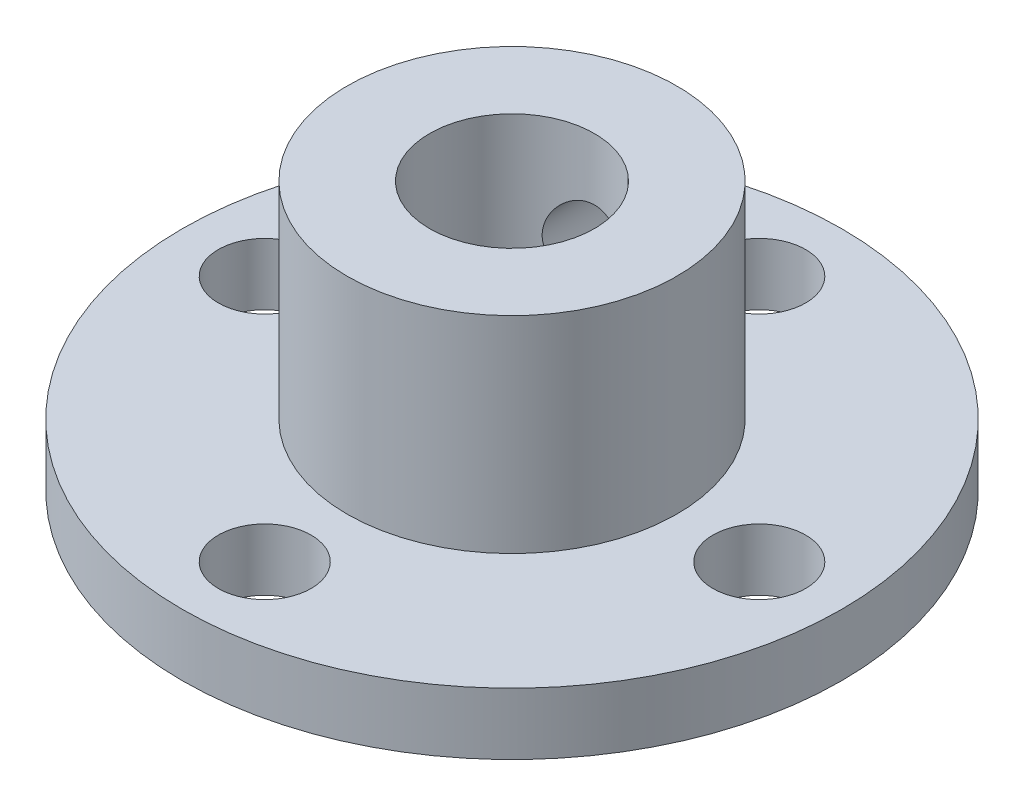
ISO-10303-21;
HEADER;
FILE_DESCRIPTION(('STEP AP214'),'2;1');
FILE_NAME('part.step','',(''),(''),'','','');
FILE_SCHEMA(('AUTOMOTIVE_DESIGN { 1 0 10303 214 1 1 1 1 }'));
ENDSEC;
DATA;
#1=APPLICATION_CONTEXT('core data for automotive mechanical design processes');
#2=APPLICATION_PROTOCOL_DEFINITION('international standard','automotive_design',2000,#1);
#3=PRODUCT_CONTEXT('',#1,'mechanical');
#4=PRODUCT('Part','Part','',(#3));
#5=PRODUCT_RELATED_PRODUCT_CATEGORY('part','',(#4));
#6=PRODUCT_DEFINITION_FORMATION('','',#4);
#7=PRODUCT_DEFINITION_CONTEXT('part definition',#1,'design');
#8=PRODUCT_DEFINITION('design','',#6,#7);
#9=PRODUCT_DEFINITION_SHAPE('','',#8);
#10=(LENGTH_UNIT() NAMED_UNIT(*) SI_UNIT(.MILLI.,.METRE.));
#11=(NAMED_UNIT(*) PLANE_ANGLE_UNIT() SI_UNIT($,.RADIAN.));
#12=(NAMED_UNIT(*) SI_UNIT($,.STERADIAN.) SOLID_ANGLE_UNIT());
#13=UNCERTAINTY_MEASURE_WITH_UNIT(LENGTH_MEASURE(1.E-05),#10,'distance_accuracy_value','');
#14=(GEOMETRIC_REPRESENTATION_CONTEXT(3) GLOBAL_UNCERTAINTY_ASSIGNED_CONTEXT((#13)) GLOBAL_UNIT_ASSIGNED_CONTEXT((#10,
#11,#12)) REPRESENTATION_CONTEXT('',''));
#15=CARTESIAN_POINT('',(0.,0.,0.));
#16=DIRECTION('',(0.,0.,1.));
#17=DIRECTION('',(1.,0.,0.));
#18=AXIS2_PLACEMENT_3D('',#15,#16,#17);
#19=CARTESIAN_POINT('',(0.,3.,0.));
#20=DIRECTION('',(0.,-1.,0.));
#21=DIRECTION('',(0.,0.,-1.));
#22=AXIS2_PLACEMENT_3D('',#19,#20,#21);
#23=CYLINDRICAL_SURFACE('',#22,16.);
#24=CARTESIAN_POINT('',(0.,3.,0.));
#25=DIRECTION('',(0.,1.,0.));
#26=DIRECTION('',(0.,0.,1.));
#27=AXIS2_PLACEMENT_3D('',#24,#25,#26);
#28=CIRCLE('',#27,16.);
#29=CARTESIAN_POINT('',(0.,3.,16.));
#30=VERTEX_POINT('',#29);
#31=EDGE_CURVE('E48',#30,#30,#28,.T.);
#32=ORIENTED_EDGE('',*,*,#31,.F.);
#33=EDGE_LOOP('',(#32));
#34=FACE_BOUND('',#33,.T.);
#35=CARTESIAN_POINT('',(0.,0.,0.));
#36=DIRECTION('',(0.,1.,0.));
#37=DIRECTION('',(0.,0.,1.));
#38=AXIS2_PLACEMENT_3D('',#35,#36,#37);
#39=CIRCLE('',#38,16.);
#40=CARTESIAN_POINT('',(0.,0.,16.));
#41=VERTEX_POINT('',#40);
#42=EDGE_CURVE('E43',#41,#41,#39,.T.);
#43=ORIENTED_EDGE('',*,*,#42,.T.);
#44=EDGE_LOOP('',(#43));
#45=FACE_BOUND('',#44,.T.);
#46=ADVANCED_FACE('F40',(#34,#45),#23,.T.);
#47=CARTESIAN_POINT('',(0.,3.,0.));
#48=DIRECTION('',(0.,1.,0.));
#49=DIRECTION('',(0.,0.,1.));
#50=AXIS2_PLACEMENT_3D('',#47,#48,#49);
#51=PLANE('',#50);
#52=CARTESIAN_POINT('',(0.,3.,-12.));
#53=DIRECTION('',(0.,1.,0.));
#54=DIRECTION('',(0.,0.,1.));
#55=AXIS2_PLACEMENT_3D('',#52,#53,#54);
#56=CIRCLE('',#55,2.25);
#57=CARTESIAN_POINT('',(0.,3.,-9.75));
#58=VERTEX_POINT('',#57);
#59=EDGE_CURVE('E90',#58,#58,#56,.T.);
#60=ORIENTED_EDGE('',*,*,#59,.F.);
#61=EDGE_LOOP('',(#60));
#62=FACE_BOUND('',#61,.T.);
#63=CARTESIAN_POINT('',(12.0000000000003,3.,-3.38856148926383E-13));
#64=DIRECTION('',(0.,1.,0.));
#65=DIRECTION('',(0.,0.,1.));
#66=AXIS2_PLACEMENT_3D('',#63,#64,#65);
#67=CIRCLE('',#66,2.25000000000027);
#68=CARTESIAN_POINT('',(12.0000000000003,3.,2.24999999999993));
#69=VERTEX_POINT('',#68);
#70=EDGE_CURVE('E86',#69,#69,#67,.T.);
#71=ORIENTED_EDGE('',*,*,#70,.F.);
#72=EDGE_LOOP('',(#71));
#73=FACE_BOUND('',#72,.T.);
#74=CARTESIAN_POINT('',(6.77712297852766E-13,3.,12.));
#75=DIRECTION('',(0.,1.,0.));
#76=DIRECTION('',(0.,0.,1.));
#77=AXIS2_PLACEMENT_3D('',#74,#75,#76);
#78=CIRCLE('',#77,2.25000000000073);
#79=CARTESIAN_POINT('',(6.77712297852766E-13,3.,14.2500000000007));
#80=VERTEX_POINT('',#79);
#81=EDGE_CURVE('E78',#80,#80,#78,.T.);
#82=ORIENTED_EDGE('',*,*,#81,.F.);
#83=EDGE_LOOP('',(#82));
#84=FACE_BOUND('',#83,.T.);
#85=CARTESIAN_POINT('',(-11.9999999999997,3.,3.4032572508536E-13));
#86=DIRECTION('',(0.,1.,0.));
#87=DIRECTION('',(0.,0.,1.));
#88=AXIS2_PLACEMENT_3D('',#85,#86,#87);
#89=CIRCLE('',#88,2.25000000000054);
#90=CARTESIAN_POINT('',(-11.9999999999997,3.,2.25000000000088));
#91=VERTEX_POINT('',#90);
#92=EDGE_CURVE('E68',#91,#91,#89,.T.);
#93=ORIENTED_EDGE('',*,*,#92,.F.);
#94=EDGE_LOOP('',(#93));
#95=FACE_BOUND('',#94,.T.);
#96=CARTESIAN_POINT('',(0.,3.,0.));
#97=DIRECTION('',(0.,1.,0.));
#98=DIRECTION('',(0.,0.,1.));
#99=AXIS2_PLACEMENT_3D('',#96,#97,#98);
#100=CIRCLE('',#99,8.);
#101=CARTESIAN_POINT('',(0.,3.,8.));
#102=VERTEX_POINT('',#101);
#103=EDGE_CURVE('E10',#102,#102,#100,.T.);
#104=ORIENTED_EDGE('',*,*,#103,.F.);
#105=EDGE_LOOP('',(#104));
#106=FACE_BOUND('',#105,.T.);
#107=ORIENTED_EDGE('',*,*,#31,.T.);
#108=EDGE_LOOP('',(#107));
#109=FACE_BOUND('',#108,.T.);
#110=ADVANCED_FACE('F150',(#62,#73,#84,#95,#106,#109),#51,.T.);
#111=CARTESIAN_POINT('',(0.,0.,0.));
#112=DIRECTION('',(0.,1.,0.));
#113=DIRECTION('',(0.,0.,1.));
#114=AXIS2_PLACEMENT_3D('',#111,#112,#113);
#115=PLANE('',#114);
#116=CARTESIAN_POINT('',(0.,0.,-12.));
#117=DIRECTION('',(0.,1.,0.));
#118=DIRECTION('',(0.,0.,1.));
#119=AXIS2_PLACEMENT_3D('',#116,#117,#118);
#120=CIRCLE('',#119,2.25);
#121=CARTESIAN_POINT('',(0.,0.,-9.75));
#122=VERTEX_POINT('',#121);
#123=EDGE_CURVE('E67',#122,#122,#120,.F.);
#124=ORIENTED_EDGE('',*,*,#123,.F.);
#125=EDGE_LOOP('',(#124));
#126=FACE_BOUND('',#125,.T.);
#127=CARTESIAN_POINT('',(12.0000000000003,0.,-3.38856148926383E-13));
#128=DIRECTION('',(0.,1.,0.));
#129=DIRECTION('',(0.,0.,1.));
#130=AXIS2_PLACEMENT_3D('',#127,#128,#129);
#131=CIRCLE('',#130,2.25000000000027);
#132=CARTESIAN_POINT('',(12.0000000000003,0.,2.24999999999993));
#133=VERTEX_POINT('',#132);
#134=EDGE_CURVE('E82',#133,#133,#131,.F.);
#135=ORIENTED_EDGE('',*,*,#134,.F.);
#136=EDGE_LOOP('',(#135));
#137=FACE_BOUND('',#136,.T.);
#138=CARTESIAN_POINT('',(6.77712297852766E-13,0.,12.));
#139=DIRECTION('',(0.,1.,0.));
#140=DIRECTION('',(0.,0.,1.));
#141=AXIS2_PLACEMENT_3D('',#138,#139,#140);
#142=CIRCLE('',#141,2.25000000000073);
#143=CARTESIAN_POINT('',(6.77712297852766E-13,0.,14.2500000000007));
#144=VERTEX_POINT('',#143);
#145=EDGE_CURVE('E72',#144,#144,#142,.F.);
#146=ORIENTED_EDGE('',*,*,#145,.F.);
#147=EDGE_LOOP('',(#146));
#148=FACE_BOUND('',#147,.T.);
#149=CARTESIAN_POINT('',(-11.9999999999997,0.,3.4032572508536E-13));
#150=DIRECTION('',(0.,1.,0.));
#151=DIRECTION('',(0.,0.,1.));
#152=AXIS2_PLACEMENT_3D('',#149,#150,#151);
#153=CIRCLE('',#152,2.25000000000054);
#154=CARTESIAN_POINT('',(-11.9999999999997,0.,2.25000000000088));
#155=VERTEX_POINT('',#154);
#156=EDGE_CURVE('E73',#155,#155,#153,.F.);
#157=ORIENTED_EDGE('',*,*,#156,.F.);
#158=EDGE_LOOP('',(#157));
#159=FACE_BOUND('',#158,.T.);
#160=CARTESIAN_POINT('',(0.,0.,0.));
#161=DIRECTION('',(0.,1.,0.));
#162=DIRECTION('',(0.,0.,1.));
#163=AXIS2_PLACEMENT_3D('',#160,#161,#162);
#164=CIRCLE('',#163,4.);
#165=CARTESIAN_POINT('',(0.,0.,4.));
#166=VERTEX_POINT('',#165);
#167=EDGE_CURVE('E59',#166,#166,#164,.F.);
#168=ORIENTED_EDGE('',*,*,#167,.F.);
#169=EDGE_LOOP('',(#168));
#170=FACE_BOUND('',#169,.T.);
#171=ORIENTED_EDGE('',*,*,#42,.F.);
#172=EDGE_LOOP('',(#171));
#173=FACE_BOUND('',#172,.T.);
#174=ADVANCED_FACE('F148',(#126,#137,#148,#159,#170,#173),#115,.F.);
#175=CARTESIAN_POINT('',(0.,13.,0.));
#176=DIRECTION('',(0.,-1.,0.));
#177=DIRECTION('',(0.,0.,-1.));
#178=AXIS2_PLACEMENT_3D('',#175,#176,#177);
#179=CYLINDRICAL_SURFACE('',#178,8.);
#180=CARTESIAN_POINT('',(2.,8.,-7.74596669241483));
#181=CARTESIAN_POINT('',(1.99999686287446,7.88955939925874,-7.74596880070288));
#182=CARTESIAN_POINT('',(1.99082099639812,7.77908408105718,-7.74835444811678));
#183=CARTESIAN_POINT('',(1.95441850037103,7.56130593746119,-7.75761489594051));
#184=CARTESIAN_POINT('',(1.92718136539368,7.45400499642545,-7.76449230897304));
#185=CARTESIAN_POINT('',(1.85559295970563,7.24575716945025,-7.7819097967692));
#186=CARTESIAN_POINT('',(1.81126378228359,7.14480227569143,-7.79244514152366));
#187=CARTESIAN_POINT('',(1.70681691300911,6.9517513179681,-7.81598553623007));
#188=CARTESIAN_POINT('',(1.64669855084855,6.85965563033583,-7.82899069102791));
#189=CARTESIAN_POINT('',(1.51096674184951,6.68491068379023,-7.856325730845));
#190=CARTESIAN_POINT('',(1.43506951016324,6.60248511971996,-7.87067678098427));
#191=CARTESIAN_POINT('',(1.27054565128053,6.45139088451173,-7.89890300412235));
#192=CARTESIAN_POINT('',(1.18191783534425,6.3827234995026,-7.91277813253111));
#193=CARTESIAN_POINT('',(0.992916160863164,6.26017962589498,-7.93872332416466));
#194=CARTESIAN_POINT('',(0.892395660956097,6.20652288947083,-7.95076549920474));
#195=CARTESIAN_POINT('',(0.68341054743421,6.11695228467753,-7.97144649540787));
#196=CARTESIAN_POINT('',(0.574947108633552,6.08103579846759,-7.98008581867475));
#197=CARTESIAN_POINT('',(0.355487007003329,6.02868173233713,-7.99283807078544));
#198=CARTESIAN_POINT('',(0.24458617563918,6.01186428453873,-7.99703915075451));
#199=CARTESIAN_POINT('',(0.0214630554102153,5.99699329657956,-8.00074875285838));
#200=CARTESIAN_POINT('',(-0.0907590356304549,5.99893698223232,-8.00025796877363));
#201=CARTESIAN_POINT('',(-0.310704494344775,6.02125988020012,-7.99470475962828));
#202=CARTESIAN_POINT('',(-0.418472431202134,6.04122906004308,-7.98974401872699));
#203=CARTESIAN_POINT('',(-0.629076494827373,6.0983770160388,-7.97592669219883));
#204=CARTESIAN_POINT('',(-0.731912358740876,6.13555670830193,-7.96706989918753));
#205=CARTESIAN_POINT('',(-0.930813407003613,6.22640205654965,-7.94630007760717));
#206=CARTESIAN_POINT('',(-1.02680901953301,6.2802136357294,-7.93436015756043));
#207=CARTESIAN_POINT('',(-1.20855124468098,6.40268454329301,-7.90871923047719));
#208=CARTESIAN_POINT('',(-1.29429607017101,6.4713464548485,-7.89501791721992));
#209=CARTESIAN_POINT('',(-1.45554807016991,6.6237669935859,-7.86690971015616));
#210=CARTESIAN_POINT('',(-1.5307153581504,6.70788391387822,-7.85249375620734));
#211=CARTESIAN_POINT('',(-1.66595275192604,6.8876799788322,-7.82492034813365));
#212=CARTESIAN_POINT('',(-1.72602215209203,6.9833596635928,-7.81176295284776));
#213=CARTESIAN_POINT('',(-1.8295762580452,7.18423202731917,-7.78816397465319));
#214=CARTESIAN_POINT('',(-1.87297913394098,7.28946858425056,-7.77773586980577));
#215=CARTESIAN_POINT('',(-1.94137124127268,7.50606837446116,-7.76094912111966));
#216=CARTESIAN_POINT('',(-1.96636441310582,7.61743029118651,-7.75458960648175));
#217=CARTESIAN_POINT('',(-1.99666371093214,7.8399676012185,-7.74684284831313));
#218=CARTESIAN_POINT('',(-2.0024723791357,7.9510702346637,-7.74532871274919));
#219=CARTESIAN_POINT('',(-1.99561359241244,8.17265754926253,-7.74709874784831));
#220=CARTESIAN_POINT('',(-1.98294783827904,8.28314228636099,-7.75038247681013));
#221=CARTESIAN_POINT('',(-1.93994037115013,8.49849141196377,-7.76125665563648));
#222=CARTESIAN_POINT('',(-1.9098912546254,8.60341818125668,-7.768775761875));
#223=CARTESIAN_POINT('',(-1.8332944653365,8.80674516628135,-7.7872057461677));
#224=CARTESIAN_POINT('',(-1.78674483817004,8.90514460724427,-7.79811702598891));
#225=CARTESIAN_POINT('',(-1.67741653434925,9.09475302229388,-7.8223690967461));
#226=CARTESIAN_POINT('',(-1.6143374030685,9.18578307203448,-7.83575334885313));
#227=CARTESIAN_POINT('',(-1.47412058586891,9.35615069024108,-7.86333666457373));
#228=CARTESIAN_POINT('',(-1.39698058961088,9.43548633332006,-7.87753586182776));
#229=CARTESIAN_POINT('',(-1.22852544196945,9.58224883405677,-7.90557922425285));
#230=CARTESIAN_POINT('',(-1.13690390506318,9.64932805003905,-7.91940561649468));
#231=CARTESIAN_POINT('',(-0.94340536538935,9.76714869356099,-7.94477773290987));
#232=CARTESIAN_POINT('',(-0.841528897915181,9.81789097328656,-7.95632357603169));
#233=CARTESIAN_POINT('',(-0.63111640346218,9.90115682762235,-7.9757609259065));
#234=CARTESIAN_POINT('',(-0.522634762055764,9.93381142750325,-7.98367864017925));
#235=CARTESIAN_POINT('',(-0.301499520637613,9.98036826768673,-7.99508234716634));
#236=CARTESIAN_POINT('',(-0.188846730082481,9.99427412699123,-7.99856919514738));
#237=CARTESIAN_POINT('',(0.0341670528866461,10.0027351791511,-8.00068338817612));
#238=CARTESIAN_POINT('',(0.144507653932043,9.99780341819081,-7.99943957759977));
#239=CARTESIAN_POINT('',(0.362734992829501,9.9699043454113,-7.99251792914887));
#240=CARTESIAN_POINT('',(0.470621803561857,9.94693756997366,-7.98684022314338));
#241=CARTESIAN_POINT('',(0.680342071289548,9.88389556045828,-7.97170865707778));
#242=CARTESIAN_POINT('',(0.782204989161726,9.84391309337124,-7.96227529004785));
#243=CARTESIAN_POINT('',(0.977834106083248,9.74805884196086,-7.94062577827316));
#244=CARTESIAN_POINT('',(1.07159928253127,9.69218505465903,-7.92840928277515));
#245=CARTESIAN_POINT('',(1.25080385684661,9.56456953200773,-7.90214499360574));
#246=CARTESIAN_POINT('',(1.33598997659667,9.49247971419234,-7.88806033883329));
#247=CARTESIAN_POINT('',(1.49323004054701,9.3351542960453,-7.85981298114379));
#248=CARTESIAN_POINT('',(1.56528065015318,9.24991536777767,-7.84565025934604));
#249=CARTESIAN_POINT('',(1.69552405294366,9.06679717162108,-7.81854951691005));
#250=CARTESIAN_POINT('',(1.75343323883276,8.96871175326949,-7.80563927346578));
#251=CARTESIAN_POINT('',(1.85185379317094,8.76388902025036,-7.78287910989656));
#252=CARTESIAN_POINT('',(1.8923778195043,8.65715806781231,-7.77302696466428));
#253=CARTESIAN_POINT('',(1.948845057142,8.45884597632968,-7.75903817501475));
#254=CARTESIAN_POINT('',(1.96798634119376,8.36821367122773,-7.75417326006998));
#255=CARTESIAN_POINT('',(1.99356458514354,8.18506226200462,-7.7476367716524));
#256=CARTESIAN_POINT('',(2.0000026287435,8.0925433195112,-7.74596492578215));
#257=CARTESIAN_POINT('',(2.,8.,-7.74596669241483));
#258=B_SPLINE_CURVE_WITH_KNOTS('',3,(#180,#181,#182,#183,#184,#185,#186,#187,#188,#189,#190,
#191,#192,#193,#194,#195,#196,#197,#198,#199,#200,#201,#202,#203,#204,#205,#206,#207,#208,#209,
#210,#211,#212,#213,#214,#215,#216,#217,#218,#219,#220,#221,#222,#223,#224,#225,#226,#227,#228,
#229,#230,#231,#232,#233,#234,#235,#236,#237,#238,#239,#240,#241,#242,#243,#244,#245,#246,#247,
#248,#249,#250,#251,#252,#253,#254,#255,#256,#257),.UNSPECIFIED.,.T.,.F.,(4,2,2,2,2,2,2,2,2,2,2,
2,2,2,2,2,2,2,2,2,2,2,2,2,2,2,2,2,2,2,2,2,2,2,2,2,2,2,4),(0.,0.330981953388909,
0.662156593142932,0.992904581732816,1.32366661404383,1.66099163354381,1.99834817183893,
2.34041197118336,2.68242527877674,3.01751000796277,3.35254518932816,3.68014610151158,
4.00776445379829,4.33834299403556,4.66897908375131,5.00856373257529,5.34816424959842,
5.68941145606722,6.03058560103638,6.36274859809373,6.69488101747041,7.02157924007365,
7.34831617137134,7.68146276687326,8.01466415108036,8.35620264772255,8.69772332575643,
9.03673658245543,9.3756843912723,9.70546756901965,10.0352409390158,10.3632390124777,
10.6912784459046,11.0271767726566,11.3631602525241,11.7054118182895,12.0474137709606,
12.3247826174462,12.6021278008238),.UNSPECIFIED.);
#259=CARTESIAN_POINT('',(2.,8.,-7.74596669241483));
#260=VERTEX_POINT('',#259);
#261=EDGE_CURVE('E77',#260,#260,#258,.T.);
#262=ORIENTED_EDGE('',*,*,#261,.F.);
#263=EDGE_LOOP('',(#262));
#264=FACE_BOUND('',#263,.T.);
#265=CARTESIAN_POINT('',(0.,13.,0.));
#266=DIRECTION('',(0.,1.,0.));
#267=DIRECTION('',(0.,0.,1.));
#268=AXIS2_PLACEMENT_3D('',#265,#266,#267);
#269=CIRCLE('',#268,8.);
#270=CARTESIAN_POINT('',(0.,13.,8.));
#271=VERTEX_POINT('',#270);
#272=EDGE_CURVE('E55',#271,#271,#269,.T.);
#273=ORIENTED_EDGE('',*,*,#272,.F.);
#274=EDGE_LOOP('',(#273));
#275=FACE_BOUND('',#274,.T.);
#276=ORIENTED_EDGE('',*,*,#103,.T.);
#277=EDGE_LOOP('',(#276));
#278=FACE_BOUND('',#277,.T.);
#279=ADVANCED_FACE('F144',(#264,#275,#278),#179,.T.);
#280=CARTESIAN_POINT('',(0.,13.,0.));
#281=DIRECTION('',(0.,1.,0.));
#282=DIRECTION('',(0.,0.,1.));
#283=AXIS2_PLACEMENT_3D('',#280,#281,#282);
#284=PLANE('',#283);
#285=CARTESIAN_POINT('',(0.,13.,0.));
#286=DIRECTION('',(0.,1.,0.));
#287=DIRECTION('',(0.,0.,1.));
#288=AXIS2_PLACEMENT_3D('',#285,#286,#287);
#289=CIRCLE('',#288,4.);
#290=CARTESIAN_POINT('',(0.,13.,4.));
#291=VERTEX_POINT('',#290);
#292=EDGE_CURVE('E63',#291,#291,#289,.T.);
#293=ORIENTED_EDGE('',*,*,#292,.F.);
#294=EDGE_LOOP('',(#293));
#295=FACE_BOUND('',#294,.T.);
#296=ORIENTED_EDGE('',*,*,#272,.T.);
#297=EDGE_LOOP('',(#296));
#298=FACE_BOUND('',#297,.T.);
#299=ADVANCED_FACE('F140',(#295,#298),#284,.T.);
#300=CARTESIAN_POINT('',(0.,-0.000999999999999265,0.));
#301=DIRECTION('',(0.,1.,0.));
#302=DIRECTION('',(0.,0.,1.));
#303=AXIS2_PLACEMENT_3D('',#300,#301,#302);
#304=CYLINDRICAL_SURFACE('',#303,4.);
#305=CARTESIAN_POINT('',(2.,8.,-3.46410161513775));
#306=CARTESIAN_POINT('',(1.99999158748781,8.10421320547434,-3.46411185715888));
#307=CARTESIAN_POINT('',(1.99179963610437,8.2085621765338,-3.46887633544978));
#308=CARTESIAN_POINT('',(1.95944672580053,8.4140551772306,-3.48724701669072));
#309=CARTESIAN_POINT('',(1.93525221095662,8.51519200324776,-3.50087179788183));
#310=CARTESIAN_POINT('',(1.8721998159803,8.71090315644693,-3.53498701490001));
#311=CARTESIAN_POINT('',(1.83341988295963,8.80550925884925,-3.55544089069169));
#312=CARTESIAN_POINT('',(1.74253507245138,8.98684845047615,-3.60085327291133));
#313=CARTESIAN_POINT('',(1.69042947410139,9.07358111343677,-3.62581202301253));
#314=CARTESIAN_POINT('',(1.569333074538,9.24461144313338,-3.67993738819289));
#315=CARTESIAN_POINT('',(1.49930407053533,9.32811826759177,-3.70928127465103));
#316=CARTESIAN_POINT('',(1.34650761698202,9.4828167805706,-3.76743965382121));
#317=CARTESIAN_POINT('',(1.26373385204841,9.55400232620397,-3.79625387610258));
#318=CARTESIAN_POINT('',(1.08097912631265,9.6867343011885,-3.85242953961661));
#319=CARTESIAN_POINT('',(0.980214377887154,9.74730753542331,-3.87956212851245));
#320=CARTESIAN_POINT('',(0.768314053336918,9.85028170678709,-3.92701512184167));
#321=CARTESIAN_POINT('',(0.657185076311986,9.8926941123508,-3.94733982363631));
#322=CARTESIAN_POINT('',(0.436089887818818,9.95500932253118,-3.97760922492053));
#323=CARTESIAN_POINT('',(0.326603580968786,9.9762990526921,-3.98818960442739));
#324=CARTESIAN_POINT('',(0.105141257404541,10.000332237369,-4.00015167691179));
#325=CARTESIAN_POINT('',(-0.00683321168520658,10.0030869135963,-4.00153893568935));
#326=CARTESIAN_POINT('',(-0.219665048849571,9.99050665205486,-3.99525963833124));
#327=CARTESIAN_POINT('',(-0.320642398354138,9.97672396895636,-3.98836991784381));
#328=CARTESIAN_POINT('',(-0.518627543836088,9.93423831219188,-3.96748490519435));
#329=CARTESIAN_POINT('',(-0.6156350421877,9.90553422204787,-3.95348908132771));
#330=CARTESIAN_POINT('',(-0.804618783139258,9.83383486782005,-3.91943166575325));
#331=CARTESIAN_POINT('',(-0.896506847030397,9.79064737365578,-3.89928883058403));
#332=CARTESIAN_POINT('',(-1.07195360302662,9.6914731675971,-3.8547529197337));
#333=CARTESIAN_POINT('',(-1.15550929767728,9.63548187339533,-3.83035832314967));
#334=CARTESIAN_POINT('',(-1.3203473217964,9.50620929693394,-3.7768878879846));
#335=CARTESIAN_POINT('',(-1.40066815005872,9.43179394334797,-3.7475875199635));
#336=CARTESIAN_POINT('',(-1.54820874059556,9.27082055013966,-3.68908681173623));
#337=CARTESIAN_POINT('',(-1.61541842314846,9.18425325545188,-3.65988656531258));
#338=CARTESIAN_POINT('',(-1.73901066928442,8.99470361515182,-3.60288312184969));
#339=CARTESIAN_POINT('',(-1.7944346299561,8.89102795389158,-3.57528639981415));
#340=CARTESIAN_POINT('',(-1.88663822600246,8.67412465728201,-3.52750900557152));
#341=CARTESIAN_POINT('',(-1.92343731642178,8.56090713396488,-3.50732060092135));
#342=CARTESIAN_POINT('',(-1.97436042205008,8.33757097743442,-3.47889271634069));
#343=CARTESIAN_POINT('',(-1.99005024423995,8.2279177619129,-3.46983311696993));
#344=CARTESIAN_POINT('',(-2.00303389322285,8.00719731696691,-3.46235838723219));
#345=CARTESIAN_POINT('',(-2.00034071463005,7.8961311417604,-3.46393573778623));
#346=CARTESIAN_POINT('',(-1.97807208668793,7.68869216284256,-3.4766867308117));
#347=CARTESIAN_POINT('',(-1.96037563342492,7.59204109778422,-3.48679175013308));
#348=CARTESIAN_POINT('',(-1.91139256926489,7.40326442745801,-3.51388043102682));
#349=CARTESIAN_POINT('',(-1.88010155724727,7.31114029850652,-3.53086632010068));
#350=CARTESIAN_POINT('',(-1.80329517720973,7.12917733819489,-3.57072444159313));
#351=CARTESIAN_POINT('',(-1.7571881273853,7.03964196629395,-3.59383286486126));
#352=CARTESIAN_POINT('',(-1.65257412803176,6.86906145692096,-3.643122389945));
#353=CARTESIAN_POINT('',(-1.59406080866499,6.78802071296949,-3.66930506710298));
#354=CARTESIAN_POINT('',(-1.45767433439709,6.62604246495734,-3.72575996912669));
#355=CARTESIAN_POINT('',(-1.37829054462748,6.54640569858222,-3.75613166308566));
#356=CARTESIAN_POINT('',(-1.20680899079904,6.40117552399527,-3.81468469955797));
#357=CARTESIAN_POINT('',(-1.11470694931991,6.33558685947316,-3.84286530015463));
#358=CARTESIAN_POINT('',(-0.917070725108059,6.21885254816729,-3.89482723381868));
#359=CARTESIAN_POINT('',(-0.811246195112495,6.16813376383323,-3.91847283343884));
#360=CARTESIAN_POINT('',(-0.591044729317865,6.08572419203039,-3.95766709918776));
#361=CARTESIAN_POINT('',(-0.476675402917653,6.0540166963159,-3.97322287353397));
#362=CARTESIAN_POINT('',(-0.253959364539764,6.01326287251486,-3.99335016363174));
#363=CARTESIAN_POINT('',(-0.1460228872683,6.00240425133572,-3.9987985581427));
#364=CARTESIAN_POINT('',(0.0702519714699456,5.99831346600433,-4.00084260752374));
#365=CARTESIAN_POINT('',(0.178590198981614,6.00507513147113,-3.99744136141634));
#366=CARTESIAN_POINT('',(0.385075986136858,6.03483282431641,-3.98267937668509));
#367=CARTESIAN_POINT('',(0.483424641057418,6.05672973730905,-3.97185789309443));
#368=CARTESIAN_POINT('',(0.674891898931564,6.11465395980667,-3.94384187353387));
#369=CARTESIAN_POINT('',(0.768009749669771,6.15068329570691,-3.92664642364424));
#370=CARTESIAN_POINT('',(0.950846833596741,6.2374542549914,-3.8865186139318));
#371=CARTESIAN_POINT('',(1.0402503657229,6.28875921975186,-3.86337234005404));
#372=CARTESIAN_POINT('',(1.20954920326828,6.40391528811809,-3.81376266676027));
#373=CARTESIAN_POINT('',(1.28944011444319,6.46777215410157,-3.78729774583428));
#374=CARTESIAN_POINT('',(1.44582833859495,6.61359663555941,-3.73057218840582));
#375=CARTESIAN_POINT('',(1.52119665879199,6.69673418080028,-3.70019591726075));
#376=CARTESIAN_POINT('',(1.65732528394006,6.87489222830609,-3.64126158628571));
#377=CARTESIAN_POINT('',(1.71807266521244,6.96992313136052,-3.61270515130784));
#378=CARTESIAN_POINT('',(1.82486714716811,7.17330889413024,-3.55999186256751));
#379=CARTESIAN_POINT('',(1.87038902381914,7.28198991073527,-3.53600256268535));
#380=CARTESIAN_POINT('',(1.92395929504801,7.45057811963094,-3.5069621813237));
#381=CARTESIAN_POINT('',(1.93935666147967,7.50764782059068,-3.49844389329401));
#382=CARTESIAN_POINT('',(1.96508069805043,7.62323255750019,-3.48406059323535));
#383=CARTESIAN_POINT('',(1.97541091343282,7.68174655275425,-3.47819372636051));
#384=CARTESIAN_POINT('',(1.9887293296122,7.78360078924729,-3.47059023668758));
#385=CARTESIAN_POINT('',(1.99295091983786,7.82673305725007,-3.46816389731816));
#386=CARTESIAN_POINT('',(1.99858810035606,7.9132356930929,-3.46491740045177));
#387=CARTESIAN_POINT('',(2.00000350293331,7.9566060766667,-3.46409735040492));
#388=CARTESIAN_POINT('',(2.,8.,-3.46410161513775));
#389=B_SPLINE_CURVE_WITH_KNOTS('',3,(#305,#306,#307,#308,#309,#310,#311,#312,#313,#314,#315,
#316,#317,#318,#319,#320,#321,#322,#323,#324,#325,#326,#327,#328,#329,#330,#331,#332,#333,#334,
#335,#336,#337,#338,#339,#340,#341,#342,#343,#344,#345,#346,#347,#348,#349,#350,#351,#352,#353,
#354,#355,#356,#357,#358,#359,#360,#361,#362,#363,#364,#365,#366,#367,#368,#369,#370,#371,#372,
#373,#374,#375,#376,#377,#378,#379,#380,#381,#382,#383,#384,#385,#386,#387,#388),.UNSPECIFIED.,
.T.,.F.,(4,2,2,2,2,2,2,2,2,2,2,2,2,2,2,2,2,2,2,2,2,2,2,2,2,2,2,2,2,2,2,2,2,2,2,2,2,2,2,2,2,4),
(0.,0.312464245189432,0.62558578564961,0.937057191861534,1.24854545093096,1.58572462503713,
1.92307142172808,2.28315784481593,2.64301653931849,2.97726969939937,3.31132047376146,
3.61632194973143,3.92134625038977,4.2305906946636,4.5399459870461,4.87854382917848,
5.21740096495904,5.57777683462963,5.93777548427476,6.2692458171249,6.60048186380812,
6.89548366852117,7.19058104876193,7.49934592816242,7.80826972444161,8.15613487165293,
8.50411729960471,8.86128362829998,9.2181355962161,9.5422454078304,9.8662417359201,
10.1688884974705,10.4715786702809,10.7872150144301,11.102996602055,11.450204837042,
11.7977188569438,12.1562149808128,12.3351395323571,12.5139387197526,12.6440387634036,
12.7741475095882),.UNSPECIFIED.);
#390=CARTESIAN_POINT('',(2.,8.,-3.46410161513775));
#391=VERTEX_POINT('',#390);
#392=EDGE_CURVE('E108',#391,#391,#389,.T.);
#393=ORIENTED_EDGE('',*,*,#392,.F.);
#394=EDGE_LOOP('',(#393));
#395=FACE_BOUND('',#394,.T.);
#396=ORIENTED_EDGE('',*,*,#292,.T.);
#397=EDGE_LOOP('',(#396));
#398=FACE_BOUND('',#397,.T.);
#399=ORIENTED_EDGE('',*,*,#167,.T.);
#400=EDGE_LOOP('',(#399));
#401=FACE_BOUND('',#400,.T.);
#402=ADVANCED_FACE('F136',(#395,#398,#401),#304,.F.);
#403=CARTESIAN_POINT('',(-11.9999999999997,-0.00100000000000013,3.4032572508536E-13));
#404=DIRECTION('',(0.,1.,0.));
#405=DIRECTION('',(0.,0.,1.));
#406=AXIS2_PLACEMENT_3D('',#403,#404,#405);
#407=CYLINDRICAL_SURFACE('',#406,2.25000000000054);
#408=CARTESIAN_POINT('',(-11.9999999999997,3.,2.25000000000088));
#409=CARTESIAN_POINT('',(-11.9999999999997,2.96875,2.25000000000088));
#410=CARTESIAN_POINT('',(-11.9999999999997,2.9375,2.25000000000088));
#411=CARTESIAN_POINT('',(-11.9999999999997,2.875,2.25000000000088));
#412=CARTESIAN_POINT('',(-11.9999999999997,2.84375,2.25000000000088));
#413=CARTESIAN_POINT('',(-11.9999999999997,2.78125,2.25000000000088));
#414=CARTESIAN_POINT('',(-11.9999999999997,2.75,2.25000000000088));
#415=CARTESIAN_POINT('',(-11.9999999999997,2.6875,2.25000000000088));
#416=CARTESIAN_POINT('',(-11.9999999999997,2.65625,2.25000000000088));
#417=CARTESIAN_POINT('',(-11.9999999999997,2.59375,2.25000000000088));
#418=CARTESIAN_POINT('',(-11.9999999999997,2.5625,2.25000000000088));
#419=CARTESIAN_POINT('',(-11.9999999999997,2.5,2.25000000000088));
#420=CARTESIAN_POINT('',(-11.9999999999997,2.46875,2.25000000000088));
#421=CARTESIAN_POINT('',(-11.9999999999997,2.40625,2.25000000000088));
#422=CARTESIAN_POINT('',(-11.9999999999997,2.375,2.25000000000088));
#423=CARTESIAN_POINT('',(-11.9999999999997,2.3125,2.25000000000088));
#424=CARTESIAN_POINT('',(-11.9999999999997,2.28125,2.25000000000088));
#425=CARTESIAN_POINT('',(-11.9999999999997,2.21875,2.25000000000088));
#426=CARTESIAN_POINT('',(-11.9999999999997,2.1875,2.25000000000088));
#427=CARTESIAN_POINT('',(-11.9999999999997,2.125,2.25000000000088));
#428=CARTESIAN_POINT('',(-11.9999999999997,2.09375,2.25000000000088));
#429=CARTESIAN_POINT('',(-11.9999999999997,2.03125,2.25000000000088));
#430=CARTESIAN_POINT('',(-11.9999999999997,2.,2.25000000000088));
#431=CARTESIAN_POINT('',(-11.9999999999997,1.9375,2.25000000000088));
#432=CARTESIAN_POINT('',(-11.9999999999997,1.90625,2.25000000000088));
#433=CARTESIAN_POINT('',(-11.9999999999997,1.84375,2.25000000000088));
#434=CARTESIAN_POINT('',(-11.9999999999997,1.8125,2.25000000000088));
#435=CARTESIAN_POINT('',(-11.9999999999997,1.75,2.25000000000088));
#436=CARTESIAN_POINT('',(-11.9999999999997,1.71875,2.25000000000088));
#437=CARTESIAN_POINT('',(-11.9999999999997,1.65625,2.25000000000088));
#438=CARTESIAN_POINT('',(-11.9999999999997,1.625,2.25000000000088));
#439=CARTESIAN_POINT('',(-11.9999999999997,1.5625,2.25000000000088));
#440=CARTESIAN_POINT('',(-11.9999999999997,1.53125,2.25000000000088));
#441=CARTESIAN_POINT('',(-11.9999999999997,1.46875,2.25000000000088));
#442=CARTESIAN_POINT('',(-11.9999999999997,1.4375,2.25000000000088));
#443=CARTESIAN_POINT('',(-11.9999999999997,1.375,2.25000000000088));
#444=CARTESIAN_POINT('',(-11.9999999999997,1.34375,2.25000000000088));
#445=CARTESIAN_POINT('',(-11.9999999999997,1.28125,2.25000000000088));
#446=CARTESIAN_POINT('',(-11.9999999999997,1.25,2.25000000000088));
#447=CARTESIAN_POINT('',(-11.9999999999997,1.1875,2.25000000000088));
#448=CARTESIAN_POINT('',(-11.9999999999997,1.15625,2.25000000000088));
#449=CARTESIAN_POINT('',(-11.9999999999997,1.09375,2.25000000000088));
#450=CARTESIAN_POINT('',(-11.9999999999997,1.0625,2.25000000000088));
#451=CARTESIAN_POINT('',(-11.9999999999997,1.,2.25000000000088));
#452=CARTESIAN_POINT('',(-11.9999999999997,0.96875,2.25000000000088));
#453=CARTESIAN_POINT('',(-11.9999999999997,0.90625,2.25000000000088));
#454=CARTESIAN_POINT('',(-11.9999999999997,0.875,2.25000000000088));
#455=CARTESIAN_POINT('',(-11.9999999999997,0.8125,2.25000000000088));
#456=CARTESIAN_POINT('',(-11.9999999999997,0.78125,2.25000000000088));
#457=CARTESIAN_POINT('',(-11.9999999999997,0.71875,2.25000000000088));
#458=CARTESIAN_POINT('',(-11.9999999999997,0.6875,2.25000000000088));
#459=CARTESIAN_POINT('',(-11.9999999999997,0.625,2.25000000000088));
#460=CARTESIAN_POINT('',(-11.9999999999997,0.59375,2.25000000000088));
#461=CARTESIAN_POINT('',(-11.9999999999997,0.53125,2.25000000000088));
#462=CARTESIAN_POINT('',(-11.9999999999997,0.5,2.25000000000088));
#463=CARTESIAN_POINT('',(-11.9999999999997,0.4375,2.25000000000088));
#464=CARTESIAN_POINT('',(-11.9999999999997,0.40625,2.25000000000088));
#465=CARTESIAN_POINT('',(-11.9999999999997,0.34375,2.25000000000088));
#466=CARTESIAN_POINT('',(-11.9999999999997,0.3125,2.25000000000088));
#467=CARTESIAN_POINT('',(-11.9999999999997,0.25,2.25000000000088));
#468=CARTESIAN_POINT('',(-11.9999999999997,0.21875,2.25000000000088));
#469=CARTESIAN_POINT('',(-11.9999999999997,0.15625,2.25000000000088));
#470=CARTESIAN_POINT('',(-11.9999999999997,0.125,2.25000000000088));
#471=CARTESIAN_POINT('',(-11.9999999999997,0.0625000000000001,2.25000000000088));
#472=CARTESIAN_POINT('',(-11.9999999999997,0.0312500000000001,2.25000000000088));
#473=CARTESIAN_POINT('',(-11.9999999999997,0.,2.25000000000088));
#474=B_SPLINE_CURVE_WITH_KNOTS('',3,(#408,#409,#410,#411,#412,#413,#414,#415,#416,#417,#418,
#419,#420,#421,#422,#423,#424,#425,#426,#427,#428,#429,#430,#431,#432,#433,#434,#435,#436,#437,
#438,#439,#440,#441,#442,#443,#444,#445,#446,#447,#448,#449,#450,#451,#452,#453,#454,#455,#456,
#457,#458,#459,#460,#461,#462,#463,#464,#465,#466,#467,#468,#469,#470,#471,#472,#473),
.UNSPECIFIED.,.F.,.F.,(4,2,2,2,2,2,2,2,2,2,2,2,2,2,2,2,2,2,2,2,2,2,2,2,2,2,2,2,2,2,2,2,4),(0.,
0.0937500000000001,0.1875,0.28125,0.375,0.46875,0.5625,0.65625,0.75,0.84375,0.9375,1.03125,
1.125,1.21875,1.3125,1.40625,1.5,1.59375,1.6875,1.78125,1.875,1.96875,2.0625,2.15625,2.25,
2.34375,2.4375,2.53125,2.625,2.71875,2.8125,2.90625,3.),.UNSPECIFIED.);
#475=EDGE_CURVE('BSEAM132',#91,#155,#474,.T.);
#476=ORIENTED_EDGE('',*,*,#92,.T.);
#477=ORIENTED_EDGE('',*,*,#156,.T.);
#478=ORIENTED_EDGE('',*,*,#475,.T.);
#479=ORIENTED_EDGE('',*,*,#475,.F.);
#480=EDGE_LOOP('',(#476,#478,#477,#479));
#481=FACE_BOUND('',#480,.T.);
#482=ADVANCED_FACE('F132',(#481),#407,.F.);
#483=CARTESIAN_POINT('',(6.77712297852766E-13,-0.00100000000000013,12.));
#484=DIRECTION('',(0.,1.,0.));
#485=DIRECTION('',(0.,0.,1.));
#486=AXIS2_PLACEMENT_3D('',#483,#484,#485);
#487=CYLINDRICAL_SURFACE('',#486,2.25000000000073);
#488=CARTESIAN_POINT('',(6.77712297852766E-13,3.,14.2500000000007));
#489=CARTESIAN_POINT('',(6.77712297852766E-13,2.96875,14.2500000000007));
#490=CARTESIAN_POINT('',(6.77712297852766E-13,2.9375,14.2500000000007));
#491=CARTESIAN_POINT('',(6.77712297852766E-13,2.875,14.2500000000007));
#492=CARTESIAN_POINT('',(6.77712297852766E-13,2.84375,14.2500000000007));
#493=CARTESIAN_POINT('',(6.77712297852766E-13,2.78125,14.2500000000007));
#494=CARTESIAN_POINT('',(6.77712297852766E-13,2.75,14.2500000000007));
#495=CARTESIAN_POINT('',(6.77712297852766E-13,2.6875,14.2500000000007));
#496=CARTESIAN_POINT('',(6.77712297852766E-13,2.65625,14.2500000000007));
#497=CARTESIAN_POINT('',(6.77712297852766E-13,2.59375,14.2500000000007));
#498=CARTESIAN_POINT('',(6.77712297852766E-13,2.5625,14.2500000000007));
#499=CARTESIAN_POINT('',(6.77712297852766E-13,2.5,14.2500000000007));
#500=CARTESIAN_POINT('',(6.77712297852766E-13,2.46875,14.2500000000007));
#501=CARTESIAN_POINT('',(6.77712297852766E-13,2.40625,14.2500000000007));
#502=CARTESIAN_POINT('',(6.77712297852766E-13,2.375,14.2500000000007));
#503=CARTESIAN_POINT('',(6.77712297852766E-13,2.3125,14.2500000000007));
#504=CARTESIAN_POINT('',(6.77712297852766E-13,2.28125,14.2500000000007));
#505=CARTESIAN_POINT('',(6.77712297852766E-13,2.21875,14.2500000000007));
#506=CARTESIAN_POINT('',(6.77712297852766E-13,2.1875,14.2500000000007));
#507=CARTESIAN_POINT('',(6.77712297852766E-13,2.125,14.2500000000007));
#508=CARTESIAN_POINT('',(6.77712297852766E-13,2.09375,14.2500000000007));
#509=CARTESIAN_POINT('',(6.77712297852766E-13,2.03125,14.2500000000007));
#510=CARTESIAN_POINT('',(6.77712297852766E-13,2.,14.2500000000007));
#511=CARTESIAN_POINT('',(6.77712297852766E-13,1.9375,14.2500000000007));
#512=CARTESIAN_POINT('',(6.77712297852766E-13,1.90625,14.2500000000007));
#513=CARTESIAN_POINT('',(6.77712297852766E-13,1.84375,14.2500000000007));
#514=CARTESIAN_POINT('',(6.77712297852766E-13,1.8125,14.2500000000007));
#515=CARTESIAN_POINT('',(6.77712297852766E-13,1.75,14.2500000000007));
#516=CARTESIAN_POINT('',(6.77712297852766E-13,1.71875,14.2500000000007));
#517=CARTESIAN_POINT('',(6.77712297852766E-13,1.65625,14.2500000000007));
#518=CARTESIAN_POINT('',(6.77712297852766E-13,1.625,14.2500000000007));
#519=CARTESIAN_POINT('',(6.77712297852766E-13,1.5625,14.2500000000007));
#520=CARTESIAN_POINT('',(6.77712297852766E-13,1.53125,14.2500000000007));
#521=CARTESIAN_POINT('',(6.77712297852766E-13,1.46875,14.2500000000007));
#522=CARTESIAN_POINT('',(6.77712297852766E-13,1.4375,14.2500000000007));
#523=CARTESIAN_POINT('',(6.77712297852766E-13,1.375,14.2500000000007));
#524=CARTESIAN_POINT('',(6.77712297852766E-13,1.34375,14.2500000000007));
#525=CARTESIAN_POINT('',(6.77712297852766E-13,1.28125,14.2500000000007));
#526=CARTESIAN_POINT('',(6.77712297852766E-13,1.25,14.2500000000007));
#527=CARTESIAN_POINT('',(6.77712297852766E-13,1.1875,14.2500000000007));
#528=CARTESIAN_POINT('',(6.77712297852766E-13,1.15625,14.2500000000007));
#529=CARTESIAN_POINT('',(6.77712297852766E-13,1.09375,14.2500000000007));
#530=CARTESIAN_POINT('',(6.77712297852766E-13,1.0625,14.2500000000007));
#531=CARTESIAN_POINT('',(6.77712297852766E-13,1.,14.2500000000007));
#532=CARTESIAN_POINT('',(6.77712297852766E-13,0.96875,14.2500000000007));
#533=CARTESIAN_POINT('',(6.77712297852766E-13,0.90625,14.2500000000007));
#534=CARTESIAN_POINT('',(6.77712297852766E-13,0.875,14.2500000000007));
#535=CARTESIAN_POINT('',(6.77712297852766E-13,0.8125,14.2500000000007));
#536=CARTESIAN_POINT('',(6.77712297852766E-13,0.78125,14.2500000000007));
#537=CARTESIAN_POINT('',(6.77712297852766E-13,0.71875,14.2500000000007));
#538=CARTESIAN_POINT('',(6.77712297852766E-13,0.6875,14.2500000000007));
#539=CARTESIAN_POINT('',(6.77712297852766E-13,0.625,14.2500000000007));
#540=CARTESIAN_POINT('',(6.77712297852766E-13,0.59375,14.2500000000007));
#541=CARTESIAN_POINT('',(6.77712297852766E-13,0.53125,14.2500000000007));
#542=CARTESIAN_POINT('',(6.77712297852766E-13,0.5,14.2500000000007));
#543=CARTESIAN_POINT('',(6.77712297852766E-13,0.4375,14.2500000000007));
#544=CARTESIAN_POINT('',(6.77712297852766E-13,0.40625,14.2500000000007));
#545=CARTESIAN_POINT('',(6.77712297852766E-13,0.34375,14.2500000000007));
#546=CARTESIAN_POINT('',(6.77712297852766E-13,0.3125,14.2500000000007));
#547=CARTESIAN_POINT('',(6.77712297852766E-13,0.25,14.2500000000007));
#548=CARTESIAN_POINT('',(6.77712297852766E-13,0.21875,14.2500000000007));
#549=CARTESIAN_POINT('',(6.77712297852766E-13,0.15625,14.2500000000007));
#550=CARTESIAN_POINT('',(6.77712297852766E-13,0.125,14.2500000000007));
#551=CARTESIAN_POINT('',(6.77712297852766E-13,0.0625000000000001,14.2500000000007));
#552=CARTESIAN_POINT('',(6.77712297852766E-13,0.0312500000000001,14.2500000000007));
#553=CARTESIAN_POINT('',(6.77712297852766E-13,0.,14.2500000000007));
#554=B_SPLINE_CURVE_WITH_KNOTS('',3,(#488,#489,#490,#491,#492,#493,#494,#495,#496,#497,#498,
#499,#500,#501,#502,#503,#504,#505,#506,#507,#508,#509,#510,#511,#512,#513,#514,#515,#516,#517,
#518,#519,#520,#521,#522,#523,#524,#525,#526,#527,#528,#529,#530,#531,#532,#533,#534,#535,#536,
#537,#538,#539,#540,#541,#542,#543,#544,#545,#546,#547,#548,#549,#550,#551,#552,#553),
.UNSPECIFIED.,.F.,.F.,(4,2,2,2,2,2,2,2,2,2,2,2,2,2,2,2,2,2,2,2,2,2,2,2,2,2,2,2,2,2,2,2,4),(0.,
0.0937500000000001,0.1875,0.28125,0.375,0.46875,0.5625,0.65625,0.75,0.84375,0.9375,1.03125,
1.125,1.21875,1.3125,1.40625,1.5,1.59375,1.6875,1.78125,1.875,1.96875,2.0625,2.15625,2.25,
2.34375,2.4375,2.53125,2.625,2.71875,2.8125,2.90625,3.),.UNSPECIFIED.);
#555=EDGE_CURVE('BSEAM128',#80,#144,#554,.T.);
#556=ORIENTED_EDGE('',*,*,#81,.T.);
#557=ORIENTED_EDGE('',*,*,#145,.T.);
#558=ORIENTED_EDGE('',*,*,#555,.T.);
#559=ORIENTED_EDGE('',*,*,#555,.F.);
#560=EDGE_LOOP('',(#556,#558,#557,#559));
#561=FACE_BOUND('',#560,.T.);
#562=ADVANCED_FACE('F128',(#561),#487,.F.);
#563=CARTESIAN_POINT('',(12.0000000000003,-0.00100000000000013,-3.38856148926383E-13));
#564=DIRECTION('',(0.,1.,0.));
#565=DIRECTION('',(0.,0.,1.));
#566=AXIS2_PLACEMENT_3D('',#563,#564,#565);
#567=CYLINDRICAL_SURFACE('',#566,2.25000000000027);
#568=CARTESIAN_POINT('',(12.0000000000003,3.,2.24999999999993));
#569=CARTESIAN_POINT('',(12.0000000000003,2.96875,2.24999999999993));
#570=CARTESIAN_POINT('',(12.0000000000003,2.9375,2.24999999999993));
#571=CARTESIAN_POINT('',(12.0000000000003,2.875,2.24999999999993));
#572=CARTESIAN_POINT('',(12.0000000000003,2.84375,2.24999999999993));
#573=CARTESIAN_POINT('',(12.0000000000003,2.78125,2.24999999999993));
#574=CARTESIAN_POINT('',(12.0000000000003,2.75,2.24999999999993));
#575=CARTESIAN_POINT('',(12.0000000000003,2.6875,2.24999999999993));
#576=CARTESIAN_POINT('',(12.0000000000003,2.65625,2.24999999999993));
#577=CARTESIAN_POINT('',(12.0000000000003,2.59375,2.24999999999993));
#578=CARTESIAN_POINT('',(12.0000000000003,2.5625,2.24999999999993));
#579=CARTESIAN_POINT('',(12.0000000000003,2.5,2.24999999999993));
#580=CARTESIAN_POINT('',(12.0000000000003,2.46875,2.24999999999993));
#581=CARTESIAN_POINT('',(12.0000000000003,2.40625,2.24999999999993));
#582=CARTESIAN_POINT('',(12.0000000000003,2.375,2.24999999999993));
#583=CARTESIAN_POINT('',(12.0000000000003,2.3125,2.24999999999993));
#584=CARTESIAN_POINT('',(12.0000000000003,2.28125,2.24999999999993));
#585=CARTESIAN_POINT('',(12.0000000000003,2.21875,2.24999999999993));
#586=CARTESIAN_POINT('',(12.0000000000003,2.1875,2.24999999999993));
#587=CARTESIAN_POINT('',(12.0000000000003,2.125,2.24999999999993));
#588=CARTESIAN_POINT('',(12.0000000000003,2.09375,2.24999999999993));
#589=CARTESIAN_POINT('',(12.0000000000003,2.03125,2.24999999999993));
#590=CARTESIAN_POINT('',(12.0000000000003,2.,2.24999999999993));
#591=CARTESIAN_POINT('',(12.0000000000003,1.9375,2.24999999999993));
#592=CARTESIAN_POINT('',(12.0000000000003,1.90625,2.24999999999993));
#593=CARTESIAN_POINT('',(12.0000000000003,1.84375,2.24999999999993));
#594=CARTESIAN_POINT('',(12.0000000000003,1.8125,2.24999999999993));
#595=CARTESIAN_POINT('',(12.0000000000003,1.75,2.24999999999993));
#596=CARTESIAN_POINT('',(12.0000000000003,1.71875,2.24999999999993));
#597=CARTESIAN_POINT('',(12.0000000000003,1.65625,2.24999999999993));
#598=CARTESIAN_POINT('',(12.0000000000003,1.625,2.24999999999993));
#599=CARTESIAN_POINT('',(12.0000000000003,1.5625,2.24999999999993));
#600=CARTESIAN_POINT('',(12.0000000000003,1.53125,2.24999999999993));
#601=CARTESIAN_POINT('',(12.0000000000003,1.46875,2.24999999999993));
#602=CARTESIAN_POINT('',(12.0000000000003,1.4375,2.24999999999993));
#603=CARTESIAN_POINT('',(12.0000000000003,1.375,2.24999999999993));
#604=CARTESIAN_POINT('',(12.0000000000003,1.34375,2.24999999999993));
#605=CARTESIAN_POINT('',(12.0000000000003,1.28125,2.24999999999993));
#606=CARTESIAN_POINT('',(12.0000000000003,1.25,2.24999999999993));
#607=CARTESIAN_POINT('',(12.0000000000003,1.1875,2.24999999999993));
#608=CARTESIAN_POINT('',(12.0000000000003,1.15625,2.24999999999993));
#609=CARTESIAN_POINT('',(12.0000000000003,1.09375,2.24999999999993));
#610=CARTESIAN_POINT('',(12.0000000000003,1.0625,2.24999999999993));
#611=CARTESIAN_POINT('',(12.0000000000003,1.,2.24999999999993));
#612=CARTESIAN_POINT('',(12.0000000000003,0.96875,2.24999999999993));
#613=CARTESIAN_POINT('',(12.0000000000003,0.90625,2.24999999999993));
#614=CARTESIAN_POINT('',(12.0000000000003,0.875,2.24999999999993));
#615=CARTESIAN_POINT('',(12.0000000000003,0.8125,2.24999999999993));
#616=CARTESIAN_POINT('',(12.0000000000003,0.78125,2.24999999999993));
#617=CARTESIAN_POINT('',(12.0000000000003,0.71875,2.24999999999993));
#618=CARTESIAN_POINT('',(12.0000000000003,0.6875,2.24999999999993));
#619=CARTESIAN_POINT('',(12.0000000000003,0.625,2.24999999999993));
#620=CARTESIAN_POINT('',(12.0000000000003,0.59375,2.24999999999993));
#621=CARTESIAN_POINT('',(12.0000000000003,0.53125,2.24999999999993));
#622=CARTESIAN_POINT('',(12.0000000000003,0.5,2.24999999999993));
#623=CARTESIAN_POINT('',(12.0000000000003,0.4375,2.24999999999993));
#624=CARTESIAN_POINT('',(12.0000000000003,0.40625,2.24999999999993));
#625=CARTESIAN_POINT('',(12.0000000000003,0.34375,2.24999999999993));
#626=CARTESIAN_POINT('',(12.0000000000003,0.3125,2.24999999999993));
#627=CARTESIAN_POINT('',(12.0000000000003,0.25,2.24999999999993));
#628=CARTESIAN_POINT('',(12.0000000000003,0.21875,2.24999999999993));
#629=CARTESIAN_POINT('',(12.0000000000003,0.15625,2.24999999999993));
#630=CARTESIAN_POINT('',(12.0000000000003,0.125,2.24999999999993));
#631=CARTESIAN_POINT('',(12.0000000000003,0.0625000000000001,2.24999999999993));
#632=CARTESIAN_POINT('',(12.0000000000003,0.0312500000000001,2.24999999999993));
#633=CARTESIAN_POINT('',(12.0000000000003,0.,2.24999999999993));
#634=B_SPLINE_CURVE_WITH_KNOTS('',3,(#568,#569,#570,#571,#572,#573,#574,#575,#576,#577,#578,
#579,#580,#581,#582,#583,#584,#585,#586,#587,#588,#589,#590,#591,#592,#593,#594,#595,#596,#597,
#598,#599,#600,#601,#602,#603,#604,#605,#606,#607,#608,#609,#610,#611,#612,#613,#614,#615,#616,
#617,#618,#619,#620,#621,#622,#623,#624,#625,#626,#627,#628,#629,#630,#631,#632,#633),
.UNSPECIFIED.,.F.,.F.,(4,2,2,2,2,2,2,2,2,2,2,2,2,2,2,2,2,2,2,2,2,2,2,2,2,2,2,2,2,2,2,2,4),(0.,
0.0937500000000001,0.1875,0.28125,0.375,0.46875,0.5625,0.65625,0.75,0.84375,0.9375,1.03125,
1.125,1.21875,1.3125,1.40625,1.5,1.59375,1.6875,1.78125,1.875,1.96875,2.0625,2.15625,2.25,
2.34375,2.4375,2.53125,2.625,2.71875,2.8125,2.90625,3.),.UNSPECIFIED.);
#635=EDGE_CURVE('BSEAM124',#69,#133,#634,.T.);
#636=ORIENTED_EDGE('',*,*,#70,.T.);
#637=ORIENTED_EDGE('',*,*,#134,.T.);
#638=ORIENTED_EDGE('',*,*,#635,.T.);
#639=ORIENTED_EDGE('',*,*,#635,.F.);
#640=EDGE_LOOP('',(#636,#638,#637,#639));
#641=FACE_BOUND('',#640,.T.);
#642=ADVANCED_FACE('F124',(#641),#567,.F.);
#643=CARTESIAN_POINT('',(0.,-0.00100000000000013,-12.));
#644=DIRECTION('',(0.,1.,0.));
#645=DIRECTION('',(0.,0.,1.));
#646=AXIS2_PLACEMENT_3D('',#643,#644,#645);
#647=CYLINDRICAL_SURFACE('',#646,2.25);
#648=CARTESIAN_POINT('',(0.,3.,-9.75));
#649=CARTESIAN_POINT('',(0.,2.96875,-9.75));
#650=CARTESIAN_POINT('',(0.,2.9375,-9.75));
#651=CARTESIAN_POINT('',(0.,2.875,-9.75));
#652=CARTESIAN_POINT('',(0.,2.84375,-9.75));
#653=CARTESIAN_POINT('',(0.,2.78125,-9.75));
#654=CARTESIAN_POINT('',(0.,2.75,-9.75));
#655=CARTESIAN_POINT('',(0.,2.6875,-9.75));
#656=CARTESIAN_POINT('',(0.,2.65625,-9.75));
#657=CARTESIAN_POINT('',(0.,2.59375,-9.75));
#658=CARTESIAN_POINT('',(0.,2.5625,-9.75));
#659=CARTESIAN_POINT('',(0.,2.5,-9.75));
#660=CARTESIAN_POINT('',(0.,2.46875,-9.75));
#661=CARTESIAN_POINT('',(0.,2.40625,-9.75));
#662=CARTESIAN_POINT('',(0.,2.375,-9.75));
#663=CARTESIAN_POINT('',(0.,2.3125,-9.75));
#664=CARTESIAN_POINT('',(0.,2.28125,-9.75));
#665=CARTESIAN_POINT('',(0.,2.21875,-9.75));
#666=CARTESIAN_POINT('',(0.,2.1875,-9.75));
#667=CARTESIAN_POINT('',(0.,2.125,-9.75));
#668=CARTESIAN_POINT('',(0.,2.09375,-9.75));
#669=CARTESIAN_POINT('',(0.,2.03125,-9.75));
#670=CARTESIAN_POINT('',(0.,2.,-9.75));
#671=CARTESIAN_POINT('',(0.,1.9375,-9.75));
#672=CARTESIAN_POINT('',(0.,1.90625,-9.75));
#673=CARTESIAN_POINT('',(0.,1.84375,-9.75));
#674=CARTESIAN_POINT('',(0.,1.8125,-9.75));
#675=CARTESIAN_POINT('',(0.,1.75,-9.75));
#676=CARTESIAN_POINT('',(0.,1.71875,-9.75));
#677=CARTESIAN_POINT('',(0.,1.65625,-9.75));
#678=CARTESIAN_POINT('',(0.,1.625,-9.75));
#679=CARTESIAN_POINT('',(0.,1.5625,-9.75));
#680=CARTESIAN_POINT('',(0.,1.53125,-9.75));
#681=CARTESIAN_POINT('',(0.,1.46875,-9.75));
#682=CARTESIAN_POINT('',(0.,1.4375,-9.75));
#683=CARTESIAN_POINT('',(0.,1.375,-9.75));
#684=CARTESIAN_POINT('',(0.,1.34375,-9.75));
#685=CARTESIAN_POINT('',(0.,1.28125,-9.75));
#686=CARTESIAN_POINT('',(0.,1.25,-9.75));
#687=CARTESIAN_POINT('',(0.,1.1875,-9.75));
#688=CARTESIAN_POINT('',(0.,1.15625,-9.75));
#689=CARTESIAN_POINT('',(0.,1.09375,-9.75));
#690=CARTESIAN_POINT('',(0.,1.0625,-9.75));
#691=CARTESIAN_POINT('',(0.,1.,-9.75));
#692=CARTESIAN_POINT('',(0.,0.96875,-9.75));
#693=CARTESIAN_POINT('',(0.,0.90625,-9.75));
#694=CARTESIAN_POINT('',(0.,0.875,-9.75));
#695=CARTESIAN_POINT('',(0.,0.8125,-9.75));
#696=CARTESIAN_POINT('',(0.,0.78125,-9.75));
#697=CARTESIAN_POINT('',(0.,0.71875,-9.75));
#698=CARTESIAN_POINT('',(0.,0.6875,-9.75));
#699=CARTESIAN_POINT('',(0.,0.625,-9.75));
#700=CARTESIAN_POINT('',(0.,0.59375,-9.75));
#701=CARTESIAN_POINT('',(0.,0.53125,-9.75));
#702=CARTESIAN_POINT('',(0.,0.5,-9.75));
#703=CARTESIAN_POINT('',(0.,0.4375,-9.75));
#704=CARTESIAN_POINT('',(0.,0.40625,-9.75));
#705=CARTESIAN_POINT('',(0.,0.34375,-9.75));
#706=CARTESIAN_POINT('',(0.,0.3125,-9.75));
#707=CARTESIAN_POINT('',(0.,0.25,-9.75));
#708=CARTESIAN_POINT('',(0.,0.21875,-9.75));
#709=CARTESIAN_POINT('',(0.,0.15625,-9.75));
#710=CARTESIAN_POINT('',(0.,0.125,-9.75));
#711=CARTESIAN_POINT('',(0.,0.0625000000000001,-9.75));
#712=CARTESIAN_POINT('',(0.,0.0312500000000001,-9.75));
#713=CARTESIAN_POINT('',(0.,0.,-9.75));
#714=B_SPLINE_CURVE_WITH_KNOTS('',3,(#648,#649,#650,#651,#652,#653,#654,#655,#656,#657,#658,
#659,#660,#661,#662,#663,#664,#665,#666,#667,#668,#669,#670,#671,#672,#673,#674,#675,#676,#677,
#678,#679,#680,#681,#682,#683,#684,#685,#686,#687,#688,#689,#690,#691,#692,#693,#694,#695,#696,
#697,#698,#699,#700,#701,#702,#703,#704,#705,#706,#707,#708,#709,#710,#711,#712,#713),
.UNSPECIFIED.,.F.,.F.,(4,2,2,2,2,2,2,2,2,2,2,2,2,2,2,2,2,2,2,2,2,2,2,2,2,2,2,2,2,2,2,2,4),(0.,
0.0937500000000001,0.1875,0.28125,0.375,0.46875,0.5625,0.65625,0.75,0.84375,0.9375,1.03125,
1.125,1.21875,1.3125,1.40625,1.5,1.59375,1.6875,1.78125,1.875,1.96875,2.0625,2.15625,2.25,
2.34375,2.4375,2.53125,2.625,2.71875,2.8125,2.90625,3.),.UNSPECIFIED.);
#715=EDGE_CURVE('BSEAM119',#58,#122,#714,.T.);
#716=ORIENTED_EDGE('',*,*,#59,.T.);
#717=ORIENTED_EDGE('',*,*,#123,.T.);
#718=ORIENTED_EDGE('',*,*,#715,.T.);
#719=ORIENTED_EDGE('',*,*,#715,.F.);
#720=EDGE_LOOP('',(#716,#718,#717,#719));
#721=FACE_BOUND('',#720,.T.);
#722=ADVANCED_FACE('F119',(#721),#647,.F.);
#723=CARTESIAN_POINT('',(0.,8.,-16.001));
#724=DIRECTION('',(0.,0.,1.));
#725=DIRECTION('',(1.,0.,0.));
#726=AXIS2_PLACEMENT_3D('',#723,#724,#725);
#727=CYLINDRICAL_SURFACE('',#726,2.);
#728=ORIENTED_EDGE('',*,*,#392,.T.);
#729=EDGE_LOOP('',(#728));
#730=FACE_BOUND('',#729,.T.);
#731=ORIENTED_EDGE('',*,*,#261,.T.);
#732=EDGE_LOOP('',(#731));
#733=FACE_BOUND('',#732,.T.);
#734=ADVANCED_FACE('F113',(#730,#733),#727,.F.);
#735=CLOSED_SHELL('',(#46,#110,#174,#279,#299,#402,#482,#562,#642,#722,#734));
#736=MANIFOLD_SOLID_BREP('B2',#735);
#737=ADVANCED_BREP_SHAPE_REPRESENTATION('',(#18,#736),#14);
#738=SHAPE_DEFINITION_REPRESENTATION(#9,#737);
ENDSEC;
END-ISO-10303-21;
